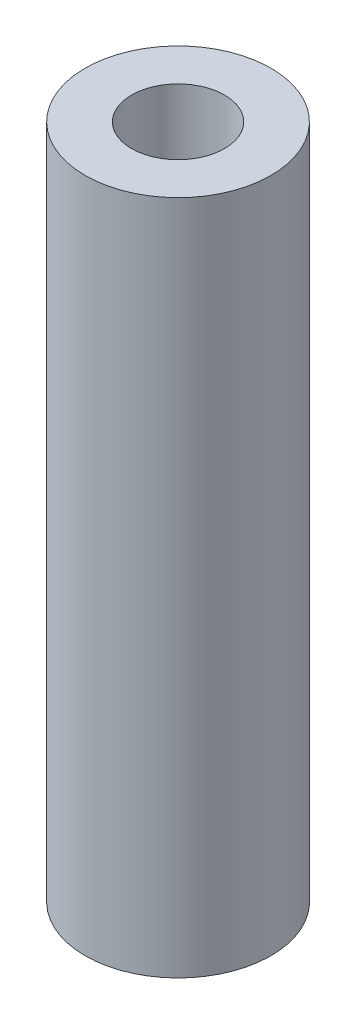
ISO-10303-21;
HEADER;
FILE_DESCRIPTION(('STEP AP214'),'2;1');
FILE_NAME('part.step','',(''),(''),'','','');
FILE_SCHEMA(('AUTOMOTIVE_DESIGN { 1 0 10303 214 1 1 1 1 }'));
ENDSEC;
DATA;
#1=APPLICATION_CONTEXT('core data for automotive mechanical design processes');
#2=APPLICATION_PROTOCOL_DEFINITION('international standard','automotive_design',2000,#1);
#3=PRODUCT_CONTEXT('',#1,'mechanical');
#4=PRODUCT('Part','Part','',(#3));
#5=PRODUCT_RELATED_PRODUCT_CATEGORY('part','',(#4));
#6=PRODUCT_DEFINITION_FORMATION('','',#4);
#7=PRODUCT_DEFINITION_CONTEXT('part definition',#1,'design');
#8=PRODUCT_DEFINITION('design','',#6,#7);
#9=PRODUCT_DEFINITION_SHAPE('','',#8);
#10=(LENGTH_UNIT() NAMED_UNIT(*) SI_UNIT(.MILLI.,.METRE.));
#11=(NAMED_UNIT(*) PLANE_ANGLE_UNIT() SI_UNIT($,.RADIAN.));
#12=(NAMED_UNIT(*) SI_UNIT($,.STERADIAN.) SOLID_ANGLE_UNIT());
#13=UNCERTAINTY_MEASURE_WITH_UNIT(LENGTH_MEASURE(1.E-05),#10,'distance_accuracy_value','');
#14=(GEOMETRIC_REPRESENTATION_CONTEXT(3) GLOBAL_UNCERTAINTY_ASSIGNED_CONTEXT((#13)) GLOBAL_UNIT_ASSIGNED_CONTEXT((#10,
#11,#12)) REPRESENTATION_CONTEXT('',''));
#15=CARTESIAN_POINT('',(0.,0.,0.));
#16=DIRECTION('',(0.,0.,1.));
#17=DIRECTION('',(1.,0.,0.));
#18=AXIS2_PLACEMENT_3D('',#15,#16,#17);
#19=CARTESIAN_POINT('',(0.,80.,0.));
#20=DIRECTION('',(0.,1.,0.));
#21=DIRECTION('',(0.,0.,1.));
#22=AXIS2_PLACEMENT_3D('',#19,#20,#21);
#23=PLANE('',#22);
#24=CARTESIAN_POINT('',(0.,80.,0.));
#25=DIRECTION('',(0.,1.,0.));
#26=DIRECTION('',(0.,0.,1.));
#27=AXIS2_PLACEMENT_3D('',#24,#25,#26);
#28=CIRCLE('',#27,11.);
#29=CARTESIAN_POINT('',(0.,80.,11.));
#30=VERTEX_POINT('',#29);
#31=EDGE_CURVE('E10',#30,#30,#28,.T.);
#32=ORIENTED_EDGE('',*,*,#31,.T.);
#33=EDGE_LOOP('',(#32));
#34=FACE_BOUND('',#33,.T.);
#35=CARTESIAN_POINT('',(0.,80.,0.));
#36=DIRECTION('',(0.,1.,0.));
#37=DIRECTION('',(0.,0.,1.));
#38=AXIS2_PLACEMENT_3D('',#35,#36,#37);
#39=CIRCLE('',#38,5.5);
#40=CARTESIAN_POINT('',(0.,80.,5.5));
#41=VERTEX_POINT('',#40);
#42=EDGE_CURVE('E46',#41,#41,#39,.T.);
#43=ORIENTED_EDGE('',*,*,#42,.F.);
#44=EDGE_LOOP('',(#43));
#45=FACE_BOUND('',#44,.T.);
#46=ADVANCED_FACE('F35',(#34,#45),#23,.T.);
#47=CARTESIAN_POINT('',(0.,0.,0.));
#48=DIRECTION('',(0.,1.,0.));
#49=DIRECTION('',(0.,0.,1.));
#50=AXIS2_PLACEMENT_3D('',#47,#48,#49);
#51=PLANE('',#50);
#52=CARTESIAN_POINT('',(0.,0.,0.));
#53=DIRECTION('',(0.,1.,0.));
#54=DIRECTION('',(0.,0.,1.));
#55=AXIS2_PLACEMENT_3D('',#52,#53,#54);
#56=CIRCLE('',#55,11.);
#57=CARTESIAN_POINT('',(0.,0.,11.));
#58=VERTEX_POINT('',#57);
#59=EDGE_CURVE('E39',#58,#58,#56,.T.);
#60=ORIENTED_EDGE('',*,*,#59,.F.);
#61=EDGE_LOOP('',(#60));
#62=FACE_BOUND('',#61,.T.);
#63=CARTESIAN_POINT('',(0.,0.,0.));
#64=DIRECTION('',(0.,1.,0.));
#65=DIRECTION('',(0.,0.,1.));
#66=AXIS2_PLACEMENT_3D('',#63,#64,#65);
#67=CIRCLE('',#66,5.5);
#68=CARTESIAN_POINT('',(0.,0.,5.5));
#69=VERTEX_POINT('',#68);
#70=EDGE_CURVE('E48',#69,#69,#67,.T.);
#71=ORIENTED_EDGE('',*,*,#70,.T.);
#72=EDGE_LOOP('',(#71));
#73=FACE_BOUND('',#72,.T.);
#74=ADVANCED_FACE('F58',(#62,#73),#51,.F.);
#75=CARTESIAN_POINT('',(0.,80.,0.));
#76=DIRECTION('',(0.,-1.,0.));
#77=DIRECTION('',(0.,0.,-1.));
#78=AXIS2_PLACEMENT_3D('',#75,#76,#77);
#79=CYLINDRICAL_SURFACE('',#78,11.);
#80=ORIENTED_EDGE('',*,*,#31,.F.);
#81=EDGE_LOOP('',(#80));
#82=FACE_BOUND('',#81,.T.);
#83=ORIENTED_EDGE('',*,*,#59,.T.);
#84=EDGE_LOOP('',(#83));
#85=FACE_BOUND('',#84,.T.);
#86=ADVANCED_FACE('F37',(#82,#85),#79,.T.);
#87=CARTESIAN_POINT('',(0.,80.,0.));
#88=DIRECTION('',(0.,-1.,0.));
#89=DIRECTION('',(0.,0.,-1.));
#90=AXIS2_PLACEMENT_3D('',#87,#88,#89);
#91=CYLINDRICAL_SURFACE('',#90,5.5);
#92=ORIENTED_EDGE('',*,*,#42,.T.);
#93=EDGE_LOOP('',(#92));
#94=FACE_BOUND('',#93,.T.);
#95=ORIENTED_EDGE('',*,*,#70,.F.);
#96=EDGE_LOOP('',(#95));
#97=FACE_BOUND('',#96,.T.);
#98=ADVANCED_FACE('F54',(#94,#97),#91,.F.);
#99=CLOSED_SHELL('',(#46,#74,#86,#98));
#100=MANIFOLD_SOLID_BREP('B2',#99);
#101=ADVANCED_BREP_SHAPE_REPRESENTATION('',(#18,#100),#14);
#102=SHAPE_DEFINITION_REPRESENTATION(#9,#101);
ENDSEC;
END-ISO-10303-21;
